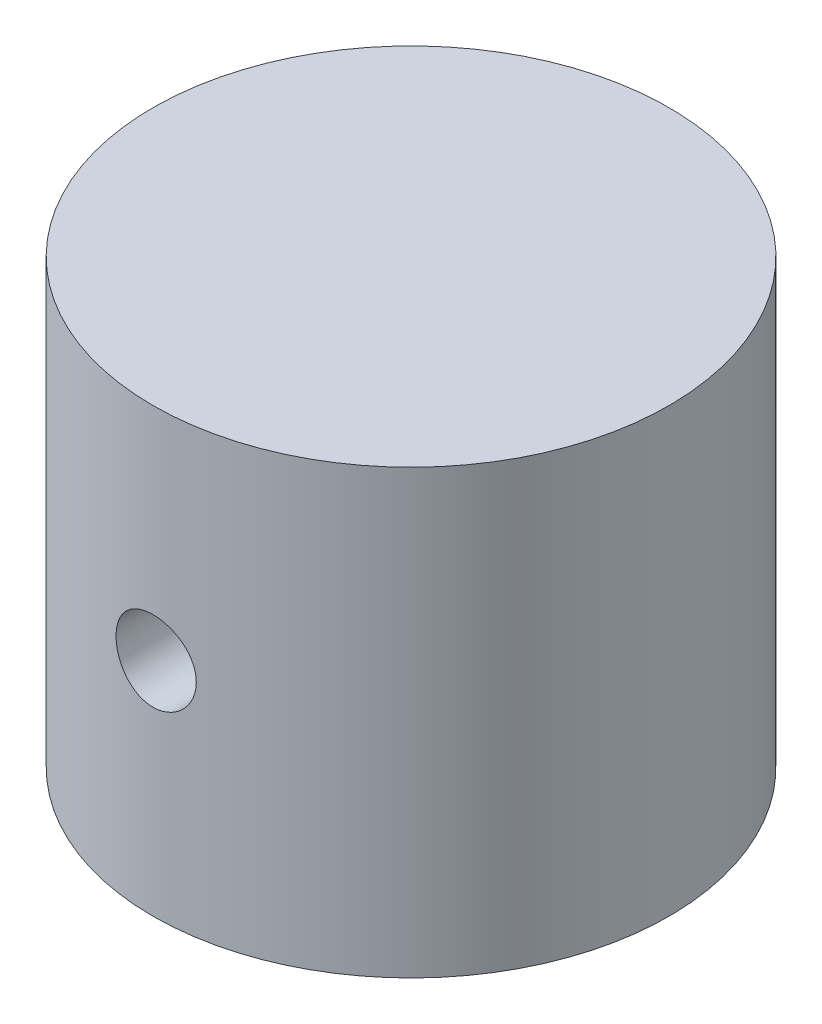
ISO-10303-21;
HEADER;
FILE_DESCRIPTION(('STEP AP214'),'2;1');
FILE_NAME('part.step','',(''),(''),'','','');
FILE_SCHEMA(('AUTOMOTIVE_DESIGN { 1 0 10303 214 1 1 1 1 }'));
ENDSEC;
DATA;
#1=APPLICATION_CONTEXT('core data for automotive mechanical design processes');
#2=APPLICATION_PROTOCOL_DEFINITION('international standard','automotive_design',2000,#1);
#3=PRODUCT_CONTEXT('',#1,'mechanical');
#4=PRODUCT('Part','Part','',(#3));
#5=PRODUCT_RELATED_PRODUCT_CATEGORY('part','',(#4));
#6=PRODUCT_DEFINITION_FORMATION('','',#4);
#7=PRODUCT_DEFINITION_CONTEXT('part definition',#1,'design');
#8=PRODUCT_DEFINITION('design','',#6,#7);
#9=PRODUCT_DEFINITION_SHAPE('','',#8);
#10=(LENGTH_UNIT() NAMED_UNIT(*) SI_UNIT(.MILLI.,.METRE.));
#11=(NAMED_UNIT(*) PLANE_ANGLE_UNIT() SI_UNIT($,.RADIAN.));
#12=(NAMED_UNIT(*) SI_UNIT($,.STERADIAN.) SOLID_ANGLE_UNIT());
#13=UNCERTAINTY_MEASURE_WITH_UNIT(LENGTH_MEASURE(1.E-05),#10,'distance_accuracy_value','');
#14=(GEOMETRIC_REPRESENTATION_CONTEXT(3) GLOBAL_UNCERTAINTY_ASSIGNED_CONTEXT((#13)) GLOBAL_UNIT_ASSIGNED_CONTEXT((#10,
#11,#12)) REPRESENTATION_CONTEXT('',''));
#15=CARTESIAN_POINT('',(0.,0.,0.));
#16=DIRECTION('',(0.,0.,1.));
#17=DIRECTION('',(1.,0.,0.));
#18=AXIS2_PLACEMENT_3D('',#15,#16,#17);
#19=CARTESIAN_POINT('',(0.,19.05,0.));
#20=DIRECTION('',(0.,-1.,0.));
#21=DIRECTION('',(0.,0.,-1.));
#22=AXIS2_PLACEMENT_3D('',#19,#20,#21);
#23=CYLINDRICAL_SURFACE('',#22,11.1125);
#24=CARTESIAN_POINT('',(0.,19.05,0.));
#25=DIRECTION('',(0.,1.,0.));
#26=DIRECTION('',(0.,0.,1.));
#27=AXIS2_PLACEMENT_3D('',#24,#25,#26);
#28=CIRCLE('',#27,11.1125);
#29=CARTESIAN_POINT('',(0.,19.05,11.1125));
#30=VERTEX_POINT('',#29);
#31=EDGE_CURVE('E50',#30,#30,#28,.T.);
#32=ORIENTED_EDGE('',*,*,#31,.F.);
#33=EDGE_LOOP('',(#32));
#34=FACE_BOUND('',#33,.T.);
#35=CARTESIAN_POINT('',(0.,0.,0.));
#36=DIRECTION('',(0.,1.,0.));
#37=DIRECTION('',(0.,0.,1.));
#38=AXIS2_PLACEMENT_3D('',#35,#36,#37);
#39=CIRCLE('',#38,11.1125);
#40=CARTESIAN_POINT('',(0.,0.,11.1125));
#41=VERTEX_POINT('',#40);
#42=EDGE_CURVE('E54',#41,#41,#39,.T.);
#43=ORIENTED_EDGE('',*,*,#42,.T.);
#44=EDGE_LOOP('',(#43));
#45=FACE_BOUND('',#44,.T.);
#46=CARTESIAN_POINT('',(0.,7.7978,11.1125));
#47=CARTESIAN_POINT('',(0.0963947299402414,7.79780394230851,11.1124984176599));
#48=CARTESIAN_POINT('',(0.19284434957281,7.80589690812618,11.1112326247757));
#49=CARTESIAN_POINT('',(0.383044783501156,7.8380450929352,11.1063049694802));
#50=CARTESIAN_POINT('',(0.476792926308397,7.86211558259502,11.1026408148588));
#51=CARTESIAN_POINT('',(0.658810544355275,7.92547976329608,11.0933279578412));
#52=CARTESIAN_POINT('',(0.747084206697021,7.9647616492175,11.0876807947157));
#53=CARTESIAN_POINT('',(0.915774402475045,8.05740404133512,11.0750249571427));
#54=CARTESIAN_POINT('',(0.996191964339329,8.11076270137282,11.0680164612647));
#55=CARTESIAN_POINT('',(1.14757252166275,8.23051920752655,11.0533510210458));
#56=CARTESIAN_POINT('',(1.21846029019744,8.29701160978436,11.0456896180625));
#57=CARTESIAN_POINT('',(1.34811972604855,8.44094462326706,11.0306165047673));
#58=CARTESIAN_POINT('',(1.4068906757398,8.51838588248633,11.0232048092661));
#59=CARTESIAN_POINT('',(1.51094378240572,8.68252740019059,11.0094270639601));
#60=CARTESIAN_POINT('',(1.55615264344917,8.76927464838881,11.0030667765768));
#61=CARTESIAN_POINT('',(1.63132975910525,8.9492467398512,10.9921731845029));
#62=CARTESIAN_POINT('',(1.66129890638288,9.04247120334933,10.9876397728064));
#63=CARTESIAN_POINT('',(1.70491116632048,9.23195821845867,10.9809572396897));
#64=CARTESIAN_POINT('',(1.718683421773,9.32819036955886,10.9787892680673));
#65=CARTESIAN_POINT('',(1.72991113299425,9.52162232573116,10.9770259211034));
#66=CARTESIAN_POINT('',(1.72736759383991,9.61882207082976,10.9774303872959));
#67=CARTESIAN_POINT('',(1.70614134581581,9.81051478183781,10.9807489872006));
#68=CARTESIAN_POINT('',(1.68760285837618,9.90502416184787,10.9836406935304));
#69=CARTESIAN_POINT('',(1.63513889645093,10.0895744782005,10.9915728946398));
#70=CARTESIAN_POINT('',(1.60121295742549,10.1796152795478,10.996613454292));
#71=CARTESIAN_POINT('',(1.51878831859843,10.3531090929228,11.0083000196113));
#72=CARTESIAN_POINT('',(1.47022890887994,10.4365327950822,11.0149526904798));
#73=CARTESIAN_POINT('',(1.35995894574365,10.594102473647,11.0291091337978));
#74=CARTESIAN_POINT('',(1.29824746664576,10.6682477964302,11.036612966137));
#75=CARTESIAN_POINT('',(1.16263531706759,10.8059915349803,11.0517251610985));
#76=CARTESIAN_POINT('',(1.08861072954133,10.8694679865675,11.0593337801824));
#77=CARTESIAN_POINT('',(0.930894966418787,10.9831158398303,11.0737234362839));
#78=CARTESIAN_POINT('',(0.847203742656918,11.033287175207,11.0805044691775));
#79=CARTESIAN_POINT('',(0.672421859940906,11.1189084006547,11.0924827679753));
#80=CARTESIAN_POINT('',(0.581326304079822,11.1543484518046,11.0976789747705));
#81=CARTESIAN_POINT('',(0.394377620767121,11.2093928192168,11.1058934146812));
#82=CARTESIAN_POINT('',(0.298524839434485,11.2289982857602,11.1089118059993));
#83=CARTESIAN_POINT('',(0.105834802625365,11.2516537847322,11.1124094707877));
#84=CARTESIAN_POINT('',(0.0090177021711753,11.2548714156687,11.1129144477452));
#85=CARTESIAN_POINT('',(-0.18377308687514,11.2451053836087,11.1113984900163));
#86=CARTESIAN_POINT('',(-0.279746803454394,11.2321222602834,11.1093776394691));
#87=CARTESIAN_POINT('',(-0.467615670533783,11.1904626435057,11.1030529908711));
#88=CARTESIAN_POINT('',(-0.559529456372774,11.1618682193234,11.0987611351929));
#89=CARTESIAN_POINT('',(-0.737258370738801,11.0898845337131,11.0883740186294));
#90=CARTESIAN_POINT('',(-0.823073194541839,11.046494533677,11.0822786677139));
#91=CARTESIAN_POINT('',(-0.986902369654649,10.9457611269892,11.0688976893029));
#92=CARTESIAN_POINT('',(-1.06485092615429,10.8883119157708,11.0616031808428));
#93=CARTESIAN_POINT('',(-1.21006041957351,10.7612376085155,11.0466623181555));
#94=CARTESIAN_POINT('',(-1.27732068644605,10.6916117497009,11.0390159419085));
#95=CARTESIAN_POINT('',(-1.39985776742122,10.5414126692801,11.024151124811));
#96=CARTESIAN_POINT('',(-1.45502194826552,10.4607470506605,11.0169371262038));
#97=CARTESIAN_POINT('',(-1.55101687790821,10.2911959376876,11.0038338772106));
#98=CARTESIAN_POINT('',(-1.59184803599013,10.20231067814,10.9979445889989));
#99=CARTESIAN_POINT('',(-1.65784521891606,10.019172675461,10.9881901032635));
#100=CARTESIAN_POINT('',(-1.68306950434526,9.92494134591008,10.9843173865483));
#101=CARTESIAN_POINT('',(-1.71732171896213,9.73351480590747,10.9790148868253));
#102=CARTESIAN_POINT('',(-1.72635085671814,9.63631981717042,10.9775849215268));
#103=CARTESIAN_POINT('',(-1.72792615459943,9.44284823935365,10.9773369720461));
#104=CARTESIAN_POINT('',(-1.72064946764922,9.34657308216554,10.9784909151623));
#105=CARTESIAN_POINT('',(-1.69020038410118,9.15663385934011,10.9832195898704));
#106=CARTESIAN_POINT('',(-1.66702802069384,9.06296978825121,10.9867943164078));
#107=CARTESIAN_POINT('',(-1.6055096730773,8.88096673789457,10.9959516916976));
#108=CARTESIAN_POINT('',(-1.56717697871261,8.79262317251647,11.0015325814187));
#109=CARTESIAN_POINT('',(-1.47644387966805,8.62359243824376,11.0140754520264));
#110=CARTESIAN_POINT('',(-1.4240429282477,8.5429055670794,11.0210374865864));
#111=CARTESIAN_POINT('',(-1.30602071221033,8.39058011454956,11.0356480687935));
#112=CARTESIAN_POINT('',(-1.24026850561635,8.31904358359018,11.0433029637697));
#113=CARTESIAN_POINT('',(-1.09768694077808,8.18795746030367,11.0583845131122));
#114=CARTESIAN_POINT('',(-1.02085501798879,8.1284106508216,11.0658111141528));
#115=CARTESIAN_POINT('',(-0.857756501130013,8.02267602165383,11.0796499089666));
#116=CARTESIAN_POINT('',(-0.771436614484828,7.97656959190634,11.0860558201001));
#117=CARTESIAN_POINT('',(-0.592217033401643,7.89957973126969,11.0970700596753));
#118=CARTESIAN_POINT('',(-0.499324183727114,7.86868072337116,11.1016802264896));
#119=CARTESIAN_POINT('',(-0.338359745746689,7.82989774343843,11.1075456842025));
#120=CARTESIAN_POINT('',(-0.271275766851942,7.81787975943622,11.1093938895157));
#121=CARTESIAN_POINT('',(-0.136136976709225,7.80182955078419,11.1118715977723));
#122=CARTESIAN_POINT('',(-0.0680821789114281,7.79779721560553,11.1125011175835));
#123=CARTESIAN_POINT('',(0.,7.7978,11.1125));
#124=B_SPLINE_CURVE_WITH_KNOTS('',3,(#46,#47,#48,#49,#50,#51,#52,#53,#54,#55,#56,#57,#58,#59,
#60,#61,#62,#63,#64,#65,#66,#67,#68,#69,#70,#71,#72,#73,#74,#75,#76,#77,#78,#79,#80,#81,#82,#83,
#84,#85,#86,#87,#88,#89,#90,#91,#92,#93,#94,#95,#96,#97,#98,#99,#100,#101,#102,#103,#104,#105,
#106,#107,#108,#109,#110,#111,#112,#113,#114,#115,#116,#117,#118,#119,#120,#121,#122,#123),
.UNSPECIFIED.,.T.,.F.,(4,2,2,2,2,2,2,2,2,2,2,2,2,2,2,2,2,2,2,2,2,2,2,2,2,2,2,2,2,2,2,2,2,2,2,2,
2,2,4),(0.,0.288935385224256,0.578147321548295,0.867135257321084,1.15608531136502,
1.44719691170932,1.73832574834665,2.03100075408992,2.32365861444324,2.61396685381538,
2.90425720994513,3.19195714196529,3.47966576008747,3.76858482399298,4.05752422956461,
4.34957012666852,4.64161747900106,4.93385957550231,5.22608044057841,5.51530667299836,
5.80452327111882,6.09223388401894,6.37995886178691,6.66991959647886,6.95989850159445,
7.25247257807135,7.54503829933271,7.83650517476127,8.12795029847099,8.41624441644251,
8.70453793245168,8.99257928287412,9.28063182918738,9.57165919389271,9.86275402912644,
10.1555766538357,10.4480987119249,10.6521723462245,10.8562431559345),.UNSPECIFIED.);
#125=CARTESIAN_POINT('',(0.,7.7978,11.1125));
#126=VERTEX_POINT('',#125);
#127=EDGE_CURVE('E10',#126,#126,#124,.T.);
#128=ORIENTED_EDGE('',*,*,#127,.F.);
#129=EDGE_LOOP('',(#128));
#130=FACE_BOUND('',#129,.T.);
#131=ADVANCED_FACE('F39',(#34,#45,#130),#23,.T.);
#132=CARTESIAN_POINT('',(0.,19.05,0.));
#133=DIRECTION('',(0.,1.,0.));
#134=DIRECTION('',(0.,0.,1.));
#135=AXIS2_PLACEMENT_3D('',#132,#133,#134);
#136=PLANE('',#135);
#137=ORIENTED_EDGE('',*,*,#31,.T.);
#138=EDGE_LOOP('',(#137));
#139=FACE_BOUND('',#138,.T.);
#140=ADVANCED_FACE('F74',(#139),#136,.T.);
#141=CARTESIAN_POINT('',(0.,0.,0.));
#142=DIRECTION('',(0.,1.,0.));
#143=DIRECTION('',(0.,0.,1.));
#144=AXIS2_PLACEMENT_3D('',#141,#142,#143);
#145=PLANE('',#144);
#146=ORIENTED_EDGE('',*,*,#42,.F.);
#147=EDGE_LOOP('',(#146));
#148=FACE_BOUND('',#147,.T.);
#149=ADVANCED_FACE('F68',(#148),#145,.F.);
#150=CARTESIAN_POINT('',(0.,9.525,11.1125));
#151=DIRECTION('',(0.,0.,-1.));
#152=DIRECTION('',(-1.,0.,0.));
#153=AXIS2_PLACEMENT_3D('',#150,#151,#152);
#154=CYLINDRICAL_SURFACE('',#153,1.7272);
#155=CARTESIAN_POINT('',(0.,9.525,0.));
#156=DIRECTION('',(0.,0.,1.));
#157=DIRECTION('',(1.,0.,0.));
#158=AXIS2_PLACEMENT_3D('',#155,#156,#157);
#159=CIRCLE('',#158,1.7272);
#160=CARTESIAN_POINT('',(1.7272,9.525,0.));
#161=VERTEX_POINT('',#160);
#162=EDGE_CURVE('E59',#161,#161,#159,.T.);
#163=ORIENTED_EDGE('',*,*,#162,.F.);
#164=EDGE_LOOP('',(#163));
#165=FACE_BOUND('',#164,.T.);
#166=ORIENTED_EDGE('',*,*,#127,.T.);
#167=EDGE_LOOP('',(#166));
#168=FACE_BOUND('',#167,.T.);
#169=ADVANCED_FACE('F66',(#165,#168),#154,.F.);
#170=CARTESIAN_POINT('',(0.,9.525,0.));
#171=DIRECTION('',(0.,0.,1.));
#172=DIRECTION('',(1.,0.,0.));
#173=AXIS2_PLACEMENT_3D('',#170,#171,#172);
#174=PLANE('',#173);
#175=ORIENTED_EDGE('',*,*,#162,.T.);
#176=EDGE_LOOP('',(#175));
#177=FACE_BOUND('',#176,.T.);
#178=ADVANCED_FACE('F64',(#177),#174,.T.);
#179=CLOSED_SHELL('',(#131,#140,#149,#169,#178));
#180=MANIFOLD_SOLID_BREP('B2',#179);
#181=ADVANCED_BREP_SHAPE_REPRESENTATION('',(#18,#180),#14);
#182=SHAPE_DEFINITION_REPRESENTATION(#9,#181);
ENDSEC;
END-ISO-10303-21;
